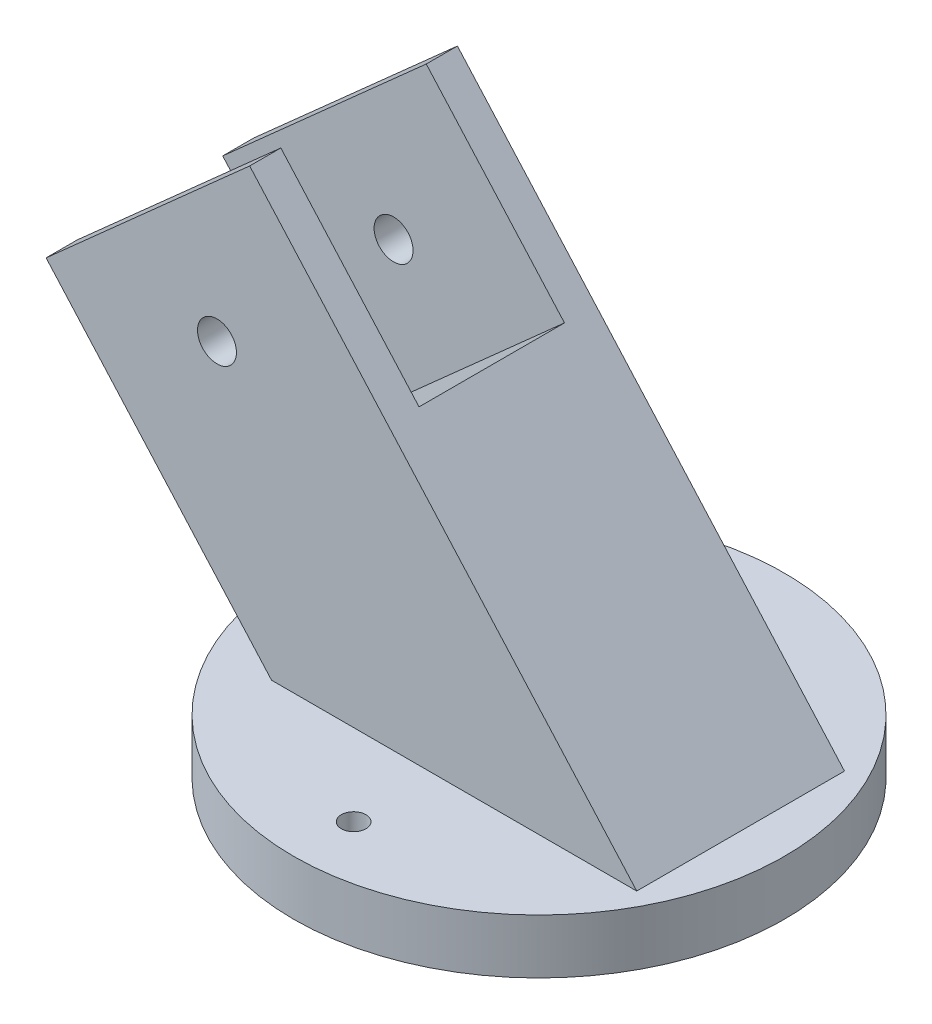
ISO-10303-21;
HEADER;
FILE_DESCRIPTION(('STEP AP214'),'2;1');
FILE_NAME('part.step','',(''),(''),'','','');
FILE_SCHEMA(('AUTOMOTIVE_DESIGN { 1 0 10303 214 1 1 1 1 }'));
ENDSEC;
DATA;
#1=APPLICATION_CONTEXT('core data for automotive mechanical design processes');
#2=APPLICATION_PROTOCOL_DEFINITION('international standard','automotive_design',2000,#1);
#3=PRODUCT_CONTEXT('',#1,'mechanical');
#4=PRODUCT('Part','Part','',(#3));
#5=PRODUCT_RELATED_PRODUCT_CATEGORY('part','',(#4));
#6=PRODUCT_DEFINITION_FORMATION('','',#4);
#7=PRODUCT_DEFINITION_CONTEXT('part definition',#1,'design');
#8=PRODUCT_DEFINITION('design','',#6,#7);
#9=PRODUCT_DEFINITION_SHAPE('','',#8);
#10=(LENGTH_UNIT() NAMED_UNIT(*) SI_UNIT(.MILLI.,.METRE.));
#11=(NAMED_UNIT(*) PLANE_ANGLE_UNIT() SI_UNIT($,.RADIAN.));
#12=(NAMED_UNIT(*) SI_UNIT($,.STERADIAN.) SOLID_ANGLE_UNIT());
#13=UNCERTAINTY_MEASURE_WITH_UNIT(LENGTH_MEASURE(1.E-05),#10,'distance_accuracy_value','');
#14=(GEOMETRIC_REPRESENTATION_CONTEXT(3) GLOBAL_UNCERTAINTY_ASSIGNED_CONTEXT((#13)) GLOBAL_UNIT_ASSIGNED_CONTEXT((#10,
#11,#12)) REPRESENTATION_CONTEXT('',''));
#15=CARTESIAN_POINT('',(0.,0.,0.));
#16=DIRECTION('',(0.,0.,1.));
#17=DIRECTION('',(1.,0.,0.));
#18=AXIS2_PLACEMENT_3D('',#15,#16,#17);
#19=CARTESIAN_POINT('',(-71.3452765123311,56.4049210702257,-19.05));
#20=DIRECTION('',(-0.66523035465436,0.746638182285392,0.));
#21=DIRECTION('',(-0.746638182285392,-0.66523035465436,0.));
#22=AXIS2_PLACEMENT_3D('',#19,#20,#21);
#23=PLANE('',#22);
#24=DIRECTION('',(-0.746638182285392,-0.66523035465436,0.));
#25=VECTOR('',#24,1.);
#26=CARTESIAN_POINT('',(-71.3452765123311,56.4049210702257,-13.335));
#27=LINE('',#26,#25);
#28=CARTESIAN_POINT('',(-34.0133673980615,89.6664388029437,-13.335));
#29=VERTEX_POINT('',#28);
#30=CARTESIAN_POINT('',(-71.3452765123311,56.4049210702257,-13.335));
#31=VERTEX_POINT('',#30);
#32=EDGE_CURVE('E125',#29,#31,#27,.T.);
#33=ORIENTED_EDGE('',*,*,#32,.F.);
#34=DIRECTION('',(0.,0.,1.));
#35=VECTOR('',#34,1.);
#36=CARTESIAN_POINT('',(-34.0133673980615,89.6664388029437,-19.05));
#37=LINE('',#36,#35);
#38=CARTESIAN_POINT('',(-34.0133673980615,89.6664388029437,-19.05));
#39=VERTEX_POINT('',#38);
#40=EDGE_CURVE('E167',#39,#29,#37,.T.);
#41=ORIENTED_EDGE('',*,*,#40,.F.);
#42=DIRECTION('',(-0.746638182285392,-0.66523035465436,0.));
#43=VECTOR('',#42,1.);
#44=CARTESIAN_POINT('',(-71.3452765123311,56.4049210702257,-19.05));
#45=LINE('',#44,#43);
#46=CARTESIAN_POINT('',(-71.3452765123311,56.4049210702257,-19.05));
#47=VERTEX_POINT('',#46);
#48=EDGE_CURVE('E155',#39,#47,#45,.T.);
#49=ORIENTED_EDGE('',*,*,#48,.T.);
#50=DIRECTION('',(0.,0.,1.));
#51=VECTOR('',#50,1.);
#52=CARTESIAN_POINT('',(-71.3452765123311,56.4049210702257,-19.05));
#53=LINE('',#52,#51);
#54=EDGE_CURVE('E164',#47,#31,#53,.T.);
#55=ORIENTED_EDGE('',*,*,#54,.T.);
#56=EDGE_LOOP('',(#33,#41,#49,#55));
#57=FACE_BOUND('',#56,.T.);
#58=ADVANCED_FACE('F43',(#57),#23,.T.);
#59=CARTESIAN_POINT('',(0.,10.,0.));
#60=DIRECTION('',(0.,1.,0.));
#61=DIRECTION('',(0.,0.,1.));
#62=AXIS2_PLACEMENT_3D('',#59,#60,#61);
#63=PLANE('',#62);
#64=CARTESIAN_POINT('',(0.,10.,-34.));
#65=DIRECTION('',(0.,1.,0.));
#66=DIRECTION('',(0.,0.,1.));
#67=AXIS2_PLACEMENT_3D('',#64,#65,#66);
#68=CIRCLE('',#67,2.25);
#69=CARTESIAN_POINT('',(0.,10.,-31.75));
#70=VERTEX_POINT('',#69);
#71=EDGE_CURVE('E178',#70,#70,#68,.T.);
#72=ORIENTED_EDGE('',*,*,#71,.F.);
#73=EDGE_LOOP('',(#72));
#74=FACE_BOUND('',#73,.T.);
#75=CARTESIAN_POINT('',(0.,10.,0.));
#76=DIRECTION('',(0.,1.,0.));
#77=DIRECTION('',(0.,0.,1.));
#78=AXIS2_PLACEMENT_3D('',#75,#76,#77);
#79=CIRCLE('',#78,45.);
#80=CARTESIAN_POINT('',(0.,10.,45.));
#81=VERTEX_POINT('',#80);
#82=EDGE_CURVE('E11',#81,#81,#79,.T.);
#83=ORIENTED_EDGE('',*,*,#82,.T.);
#84=EDGE_LOOP('',(#83));
#85=FACE_BOUND('',#84,.T.);
#86=CARTESIAN_POINT('',(0.,10.,34.));
#87=DIRECTION('',(0.,1.,0.));
#88=DIRECTION('',(0.,0.,1.));
#89=AXIS2_PLACEMENT_3D('',#86,#87,#88);
#90=CIRCLE('',#89,2.25);
#91=CARTESIAN_POINT('',(0.,10.,36.25));
#92=VERTEX_POINT('',#91);
#93=EDGE_CURVE('E172',#92,#92,#90,.T.);
#94=ORIENTED_EDGE('',*,*,#93,.F.);
#95=EDGE_LOOP('',(#94));
#96=FACE_BOUND('',#95,.T.);
#97=DIRECTION('',(0.,0.,1.));
#98=VECTOR('',#97,1.);
#99=CARTESIAN_POINT('',(-30.,10.,-19.05));
#100=LINE('',#99,#98);
#101=CARTESIAN_POINT('',(-30.,10.,-19.05));
#102=VERTEX_POINT('',#101);
#103=CARTESIAN_POINT('',(-30.,10.,19.05));
#104=VERTEX_POINT('',#103);
#105=EDGE_CURVE('E68',#102,#104,#100,.T.);
#106=ORIENTED_EDGE('',*,*,#105,.F.);
#107=DIRECTION('',(1.,0.,0.));
#108=VECTOR('',#107,1.);
#109=CARTESIAN_POINT('',(-30.,10.,-19.05));
#110=LINE('',#109,#108);
#111=CARTESIAN_POINT('',(36.9668404138595,10.,-19.05));
#112=VERTEX_POINT('',#111);
#113=EDGE_CURVE('E150',#102,#112,#110,.T.);
#114=ORIENTED_EDGE('',*,*,#113,.T.);
#115=DIRECTION('',(0.,0.,1.));
#116=VECTOR('',#115,1.);
#117=CARTESIAN_POINT('',(36.9668404138595,10.,-19.05));
#118=LINE('',#117,#116);
#119=CARTESIAN_POINT('',(36.9668404138595,10.,19.05));
#120=VERTEX_POINT('',#119);
#121=EDGE_CURVE('E161',#112,#120,#118,.T.);
#122=ORIENTED_EDGE('',*,*,#121,.T.);
#123=DIRECTION('',(1.,0.,0.));
#124=VECTOR('',#123,1.);
#125=CARTESIAN_POINT('',(-30.,10.,19.05));
#126=LINE('',#125,#124);
#127=EDGE_CURVE('E137',#104,#120,#126,.T.);
#128=ORIENTED_EDGE('',*,*,#127,.F.);
#129=EDGE_LOOP('',(#106,#114,#122,#128));
#130=FACE_BOUND('',#129,.T.);
#131=ADVANCED_FACE('F189',(#74,#85,#96,#130),#63,.T.);
#132=CARTESIAN_POINT('',(0.,0.,0.));
#133=DIRECTION('',(0.,1.,0.));
#134=DIRECTION('',(0.,0.,1.));
#135=AXIS2_PLACEMENT_3D('',#132,#133,#134);
#136=PLANE('',#135);
#137=CARTESIAN_POINT('',(0.,0.,0.));
#138=DIRECTION('',(0.,1.,0.));
#139=DIRECTION('',(0.,0.,1.));
#140=AXIS2_PLACEMENT_3D('',#137,#138,#139);
#141=CIRCLE('',#140,45.);
#142=CARTESIAN_POINT('',(0.,0.,45.));
#143=VERTEX_POINT('',#142);
#144=EDGE_CURVE('E52',#143,#143,#141,.T.);
#145=ORIENTED_EDGE('',*,*,#144,.F.);
#146=EDGE_LOOP('',(#145));
#147=FACE_BOUND('',#146,.T.);
#148=CARTESIAN_POINT('',(0.,0.,-34.));
#149=DIRECTION('',(0.,1.,0.));
#150=DIRECTION('',(0.,0.,1.));
#151=AXIS2_PLACEMENT_3D('',#148,#149,#150);
#152=CIRCLE('',#151,2.25);
#153=CARTESIAN_POINT('',(0.,0.,-31.75));
#154=VERTEX_POINT('',#153);
#155=EDGE_CURVE('E175',#154,#154,#152,.T.);
#156=ORIENTED_EDGE('',*,*,#155,.T.);
#157=EDGE_LOOP('',(#156));
#158=FACE_BOUND('',#157,.T.);
#159=CARTESIAN_POINT('',(0.,0.,34.));
#160=DIRECTION('',(0.,1.,0.));
#161=DIRECTION('',(0.,0.,1.));
#162=AXIS2_PLACEMENT_3D('',#159,#160,#161);
#163=CIRCLE('',#162,2.25);
#164=CARTESIAN_POINT('',(0.,0.,36.25));
#165=VERTEX_POINT('',#164);
#166=EDGE_CURVE('E163',#165,#165,#163,.T.);
#167=ORIENTED_EDGE('',*,*,#166,.T.);
#168=EDGE_LOOP('',(#167));
#169=FACE_BOUND('',#168,.T.);
#170=ADVANCED_FACE('F186',(#147,#158,#169),#136,.F.);
#171=CARTESIAN_POINT('',(0.,10.,0.));
#172=DIRECTION('',(0.,-1.,0.));
#173=DIRECTION('',(0.,0.,-1.));
#174=AXIS2_PLACEMENT_3D('',#171,#172,#173);
#175=CYLINDRICAL_SURFACE('',#174,45.);
#176=ORIENTED_EDGE('',*,*,#82,.F.);
#177=EDGE_LOOP('',(#176));
#178=FACE_BOUND('',#177,.T.);
#179=ORIENTED_EDGE('',*,*,#144,.T.);
#180=EDGE_LOOP('',(#179));
#181=FACE_BOUND('',#180,.T.);
#182=ADVANCED_FACE('F45',(#178,#181),#175,.T.);
#183=CARTESIAN_POINT('',(0.,10.,-34.));
#184=DIRECTION('',(0.,-1.,0.));
#185=DIRECTION('',(0.,0.,-1.));
#186=AXIS2_PLACEMENT_3D('',#183,#184,#185);
#187=CYLINDRICAL_SURFACE('',#186,2.25);
#188=ORIENTED_EDGE('',*,*,#71,.T.);
#189=EDGE_LOOP('',(#188));
#190=FACE_BOUND('',#189,.T.);
#191=ORIENTED_EDGE('',*,*,#155,.F.);
#192=EDGE_LOOP('',(#191));
#193=FACE_BOUND('',#192,.T.);
#194=ADVANCED_FACE('F196',(#190,#193),#187,.F.);
#195=CARTESIAN_POINT('',(0.,10.,34.));
#196=DIRECTION('',(0.,-1.,0.));
#197=DIRECTION('',(0.,0.,-1.));
#198=AXIS2_PLACEMENT_3D('',#195,#196,#197);
#199=CYLINDRICAL_SURFACE('',#198,2.25);
#200=ORIENTED_EDGE('',*,*,#93,.T.);
#201=EDGE_LOOP('',(#200));
#202=FACE_BOUND('',#201,.T.);
#203=ORIENTED_EDGE('',*,*,#166,.F.);
#204=EDGE_LOOP('',(#203));
#205=FACE_BOUND('',#204,.T.);
#206=ADVANCED_FACE('F194',(#202,#205),#199,.F.);
#207=CARTESIAN_POINT('',(-30.,10.,-19.05));
#208=DIRECTION('',(-0.746638182285393,-0.66523035465436,0.));
#209=DIRECTION('',(0.66523035465436,-0.746638182285393,0.));
#210=AXIS2_PLACEMENT_3D('',#207,#208,#209);
#211=PLANE('',#210);
#212=DIRECTION('',(-0.66523035465436,0.746638182285392,0.));
#213=VECTOR('',#212,1.);
#214=CARTESIAN_POINT('',(-46.,27.9580063251523,-13.335));
#215=LINE('',#214,#213);
#216=CARTESIAN_POINT('',(-46.,27.9580063251523,-13.335));
#217=VERTEX_POINT('',#216);
#218=EDGE_CURVE('E141',#217,#31,#215,.T.);
#219=ORIENTED_EDGE('',*,*,#218,.T.);
#220=ORIENTED_EDGE('',*,*,#54,.F.);
#221=DIRECTION('',(0.665230354654359,-0.746638182285393,0.));
#222=VECTOR('',#221,1.);
#223=CARTESIAN_POINT('',(-30.,10.,-19.05));
#224=LINE('',#223,#222);
#225=EDGE_CURVE('E158',#47,#102,#224,.T.);
#226=ORIENTED_EDGE('',*,*,#225,.T.);
#227=ORIENTED_EDGE('',*,*,#105,.T.);
#228=DIRECTION('',(0.665230354654359,-0.746638182285393,0.));
#229=VECTOR('',#228,1.);
#230=CARTESIAN_POINT('',(-30.,10.,19.05));
#231=LINE('',#230,#229);
#232=CARTESIAN_POINT('',(-71.3452765123311,56.4049210702257,19.05));
#233=VERTEX_POINT('',#232);
#234=EDGE_CURVE('E147',#233,#104,#231,.T.);
#235=ORIENTED_EDGE('',*,*,#234,.F.);
#236=CARTESIAN_POINT('',(-71.3452765123311,56.4049210702257,13.335));
#237=VERTEX_POINT('',#236);
#238=EDGE_CURVE('E130',#237,#233,#53,.T.);
#239=ORIENTED_EDGE('',*,*,#238,.F.);
#240=DIRECTION('',(-0.66523035465436,0.746638182285392,0.));
#241=VECTOR('',#240,1.);
#242=CARTESIAN_POINT('',(-46.,27.9580063251523,13.335));
#243=LINE('',#242,#241);
#244=CARTESIAN_POINT('',(-46.,27.9580063251523,13.335));
#245=VERTEX_POINT('',#244);
#246=EDGE_CURVE('E110',#245,#237,#243,.T.);
#247=ORIENTED_EDGE('',*,*,#246,.F.);
#248=DIRECTION('',(0.,0.,1.));
#249=VECTOR('',#248,1.);
#250=CARTESIAN_POINT('',(-46.,27.9580063251523,-13.335));
#251=LINE('',#250,#249);
#252=EDGE_CURVE('E116',#217,#245,#251,.T.);
#253=ORIENTED_EDGE('',*,*,#252,.F.);
#254=EDGE_LOOP('',(#219,#220,#226,#227,#235,#239,#247,#253));
#255=FACE_BOUND('',#254,.T.);
#256=ADVANCED_FACE('F128',(#255),#211,.T.);
#257=DIRECTION('',(0.746638182285392,0.66523035465436,0.));
#258=VECTOR('',#257,1.);
#259=CARTESIAN_POINT('',(-71.3452765123311,56.4049210702257,13.335));
#260=LINE('',#259,#258);
#261=CARTESIAN_POINT('',(-34.0133673980615,89.6664388029437,13.335));
#262=VERTEX_POINT('',#261);
#263=EDGE_CURVE('E226',#237,#262,#260,.T.);
#264=ORIENTED_EDGE('',*,*,#263,.F.);
#265=ORIENTED_EDGE('',*,*,#238,.T.);
#266=DIRECTION('',(-0.746638182285392,-0.66523035465436,0.));
#267=VECTOR('',#266,1.);
#268=CARTESIAN_POINT('',(-71.3452765123311,56.4049210702257,19.05));
#269=LINE('',#268,#267);
#270=CARTESIAN_POINT('',(-34.0133673980615,89.6664388029437,19.05));
#271=VERTEX_POINT('',#270);
#272=EDGE_CURVE('E144',#271,#233,#269,.T.);
#273=ORIENTED_EDGE('',*,*,#272,.F.);
#274=EDGE_CURVE('E170',#262,#271,#37,.T.);
#275=ORIENTED_EDGE('',*,*,#274,.F.);
#276=EDGE_LOOP('',(#264,#265,#273,#275));
#277=FACE_BOUND('',#276,.T.);
#278=ADVANCED_FACE('F204',(#277),#23,.T.);
#279=CARTESIAN_POINT('',(36.9668404138595,10.,-19.05));
#280=DIRECTION('',(0.746638182285393,0.665230354654359,0.));
#281=DIRECTION('',(-0.665230354654359,0.746638182285393,0.));
#282=AXIS2_PLACEMENT_3D('',#279,#280,#281);
#283=PLANE('',#282);
#284=DIRECTION('',(-0.66523035465436,0.746638182285392,0.));
#285=VECTOR('',#284,1.);
#286=CARTESIAN_POINT('',(-8.66809088573037,61.2195240578703,-13.335));
#287=LINE('',#286,#285);
#288=CARTESIAN_POINT('',(-8.66809088573037,61.2195240578703,-13.335));
#289=VERTEX_POINT('',#288);
#290=EDGE_CURVE('E132',#289,#29,#287,.T.);
#291=ORIENTED_EDGE('',*,*,#290,.F.);
#292=DIRECTION('',(0.,0.,-1.));
#293=VECTOR('',#292,1.);
#294=CARTESIAN_POINT('',(-8.66809088573037,61.2195240578703,-13.335));
#295=LINE('',#294,#293);
#296=CARTESIAN_POINT('',(-8.66809088573037,61.2195240578703,13.335));
#297=VERTEX_POINT('',#296);
#298=EDGE_CURVE('E115',#297,#289,#295,.T.);
#299=ORIENTED_EDGE('',*,*,#298,.F.);
#300=DIRECTION('',(-0.66523035465436,0.746638182285392,0.));
#301=VECTOR('',#300,1.);
#302=CARTESIAN_POINT('',(-8.66809088573037,61.2195240578703,13.335));
#303=LINE('',#302,#301);
#304=EDGE_CURVE('E113',#297,#262,#303,.T.);
#305=ORIENTED_EDGE('',*,*,#304,.T.);
#306=ORIENTED_EDGE('',*,*,#274,.T.);
#307=DIRECTION('',(-0.665230354654359,0.746638182285393,0.));
#308=VECTOR('',#307,1.);
#309=CARTESIAN_POINT('',(36.9668404138595,10.,19.05));
#310=LINE('',#309,#308);
#311=EDGE_CURVE('E140',#120,#271,#310,.T.);
#312=ORIENTED_EDGE('',*,*,#311,.F.);
#313=ORIENTED_EDGE('',*,*,#121,.F.);
#314=DIRECTION('',(-0.665230354654359,0.746638182285393,0.));
#315=VECTOR('',#314,1.);
#316=CARTESIAN_POINT('',(36.9668404138595,10.,-19.05));
#317=LINE('',#316,#315);
#318=EDGE_CURVE('E152',#112,#39,#317,.T.);
#319=ORIENTED_EDGE('',*,*,#318,.T.);
#320=ORIENTED_EDGE('',*,*,#40,.T.);
#321=EDGE_LOOP('',(#291,#299,#305,#306,#312,#313,#319,#320));
#322=FACE_BOUND('',#321,.T.);
#323=ADVANCED_FACE('F218',(#322),#283,.T.);
#324=CARTESIAN_POINT('',(0.,0.,-19.05));
#325=DIRECTION('',(0.,0.,1.));
#326=DIRECTION('',(1.,0.,0.));
#327=AXIS2_PLACEMENT_3D('',#324,#325,#326);
#328=PLANE('',#327);
#329=CARTESIAN_POINT('',(-40.0066836990308,58.812222564048,-19.05));
#330=DIRECTION('',(0.,0.,1.));
#331=DIRECTION('',(1.,0.,0.));
#332=AXIS2_PLACEMENT_3D('',#329,#330,#331);
#333=CIRCLE('',#332,3.57123999999999);
#334=CARTESIAN_POINT('',(-36.4354436990308,58.812222564048,-19.05));
#335=VERTEX_POINT('',#334);
#336=EDGE_CURVE('E228',#335,#335,#333,.T.);
#337=ORIENTED_EDGE('',*,*,#336,.T.);
#338=EDGE_LOOP('',(#337));
#339=FACE_BOUND('',#338,.T.);
#340=ORIENTED_EDGE('',*,*,#113,.F.);
#341=ORIENTED_EDGE('',*,*,#225,.F.);
#342=ORIENTED_EDGE('',*,*,#48,.F.);
#343=ORIENTED_EDGE('',*,*,#318,.F.);
#344=EDGE_LOOP('',(#340,#341,#342,#343));
#345=FACE_BOUND('',#344,.T.);
#346=ADVANCED_FACE('F223',(#339,#345),#328,.F.);
#347=CARTESIAN_POINT('',(0.,0.,19.05));
#348=DIRECTION('',(0.,0.,1.));
#349=DIRECTION('',(1.,0.,0.));
#350=AXIS2_PLACEMENT_3D('',#347,#348,#349);
#351=PLANE('',#350);
#352=CARTESIAN_POINT('',(-40.0066836990308,58.812222564048,19.05));
#353=DIRECTION('',(0.,0.,1.));
#354=DIRECTION('',(1.,0.,0.));
#355=AXIS2_PLACEMENT_3D('',#352,#353,#354);
#356=CIRCLE('',#355,3.57124);
#357=CARTESIAN_POINT('',(-36.4354436990308,58.812222564048,19.05));
#358=VERTEX_POINT('',#357);
#359=EDGE_CURVE('E250',#358,#358,#356,.T.);
#360=ORIENTED_EDGE('',*,*,#359,.F.);
#361=EDGE_LOOP('',(#360));
#362=FACE_BOUND('',#361,.T.);
#363=ORIENTED_EDGE('',*,*,#127,.T.);
#364=ORIENTED_EDGE('',*,*,#311,.T.);
#365=ORIENTED_EDGE('',*,*,#272,.T.);
#366=ORIENTED_EDGE('',*,*,#234,.T.);
#367=EDGE_LOOP('',(#363,#364,#365,#366));
#368=FACE_BOUND('',#367,.T.);
#369=ADVANCED_FACE('F246',(#362,#368),#351,.T.);
#370=CARTESIAN_POINT('',(-46.,27.9580063251523,-13.335));
#371=DIRECTION('',(0.,0.,-1.));
#372=DIRECTION('',(-1.,0.,0.));
#373=AXIS2_PLACEMENT_3D('',#370,#371,#372);
#374=PLANE('',#373);
#375=CARTESIAN_POINT('',(-40.0066836990308,58.812222564048,-13.335));
#376=DIRECTION('',(0.,0.,-1.));
#377=DIRECTION('',(-1.,0.,0.));
#378=AXIS2_PLACEMENT_3D('',#375,#376,#377);
#379=CIRCLE('',#378,3.57123999999999);
#380=CARTESIAN_POINT('',(-43.5779236990308,58.812222564048,-13.335));
#381=VERTEX_POINT('',#380);
#382=EDGE_CURVE('E47',#381,#381,#379,.T.);
#383=ORIENTED_EDGE('',*,*,#382,.T.);
#384=EDGE_LOOP('',(#383));
#385=FACE_BOUND('',#384,.T.);
#386=ORIENTED_EDGE('',*,*,#32,.T.);
#387=ORIENTED_EDGE('',*,*,#218,.F.);
#388=DIRECTION('',(-0.746638182285392,-0.66523035465436,0.));
#389=VECTOR('',#388,1.);
#390=CARTESIAN_POINT('',(-46.,27.9580063251523,-13.335));
#391=LINE('',#390,#389);
#392=EDGE_CURVE('E122',#289,#217,#391,.T.);
#393=ORIENTED_EDGE('',*,*,#392,.F.);
#394=ORIENTED_EDGE('',*,*,#290,.T.);
#395=EDGE_LOOP('',(#386,#387,#393,#394));
#396=FACE_BOUND('',#395,.T.);
#397=ADVANCED_FACE('F238',(#385,#396),#374,.F.);
#398=CARTESIAN_POINT('',(-46.,27.9580063251523,13.335));
#399=DIRECTION('',(0.,0.,1.));
#400=DIRECTION('',(1.,0.,0.));
#401=AXIS2_PLACEMENT_3D('',#398,#399,#400);
#402=PLANE('',#401);
#403=CARTESIAN_POINT('',(-40.0066836990308,58.812222564048,13.335));
#404=DIRECTION('',(0.,0.,1.));
#405=DIRECTION('',(1.,0.,0.));
#406=AXIS2_PLACEMENT_3D('',#403,#404,#405);
#407=CIRCLE('',#406,3.57123999999999);
#408=CARTESIAN_POINT('',(-36.4354436990308,58.812222564048,13.335));
#409=VERTEX_POINT('',#408);
#410=EDGE_CURVE('E232',#409,#409,#407,.T.);
#411=ORIENTED_EDGE('',*,*,#410,.T.);
#412=EDGE_LOOP('',(#411));
#413=FACE_BOUND('',#412,.T.);
#414=ORIENTED_EDGE('',*,*,#263,.T.);
#415=ORIENTED_EDGE('',*,*,#304,.F.);
#416=DIRECTION('',(0.746638182285392,0.66523035465436,0.));
#417=VECTOR('',#416,1.);
#418=CARTESIAN_POINT('',(-46.,27.9580063251523,13.335));
#419=LINE('',#418,#417);
#420=EDGE_CURVE('E60',#245,#297,#419,.T.);
#421=ORIENTED_EDGE('',*,*,#420,.F.);
#422=ORIENTED_EDGE('',*,*,#246,.T.);
#423=EDGE_LOOP('',(#414,#415,#421,#422));
#424=FACE_BOUND('',#423,.T.);
#425=ADVANCED_FACE('F108',(#413,#424),#402,.F.);
#426=CARTESIAN_POINT('',(-34.2428065706089,38.4332835616226,0.));
#427=DIRECTION('',(-0.66523035465436,0.746638182285392,0.));
#428=DIRECTION('',(-0.746638182285392,-0.66523035465436,0.));
#429=AXIS2_PLACEMENT_3D('',#426,#427,#428);
#430=PLANE('',#429);
#431=ORIENTED_EDGE('',*,*,#252,.T.);
#432=ORIENTED_EDGE('',*,*,#420,.T.);
#433=ORIENTED_EDGE('',*,*,#298,.T.);
#434=ORIENTED_EDGE('',*,*,#392,.T.);
#435=EDGE_LOOP('',(#431,#432,#433,#434));
#436=FACE_BOUND('',#435,.T.);
#437=ADVANCED_FACE('F120',(#436),#430,.T.);
#438=CARTESIAN_POINT('',(-40.0066836990308,58.812222564048,19.05));
#439=DIRECTION('',(0.,0.,1.));
#440=DIRECTION('',(1.,0.,0.));
#441=AXIS2_PLACEMENT_3D('',#438,#439,#440);
#442=CYLINDRICAL_SURFACE('',#441,3.57123999999999);
#443=ORIENTED_EDGE('',*,*,#382,.F.);
#444=EDGE_LOOP('',(#443));
#445=FACE_BOUND('',#444,.T.);
#446=ORIENTED_EDGE('',*,*,#336,.F.);
#447=EDGE_LOOP('',(#446));
#448=FACE_BOUND('',#447,.T.);
#449=ADVANCED_FACE('F258',(#445,#448),#442,.F.);
#450=ORIENTED_EDGE('',*,*,#359,.T.);
#451=EDGE_LOOP('',(#450));
#452=FACE_BOUND('',#451,.T.);
#453=ORIENTED_EDGE('',*,*,#410,.F.);
#454=EDGE_LOOP('',(#453));
#455=FACE_BOUND('',#454,.T.);
#456=ADVANCED_FACE('F261',(#452,#455),#442,.F.);
#457=CLOSED_SHELL('',(#58,#131,#170,#182,#194,#206,#256,#278,#323,#346,#369,#397,#425,#437,#449,#456));
#458=MANIFOLD_SOLID_BREP('B2',#457);
#459=ADVANCED_BREP_SHAPE_REPRESENTATION('',(#18,#458),#14);
#460=SHAPE_DEFINITION_REPRESENTATION(#9,#459);
ENDSEC;
END-ISO-10303-21;
